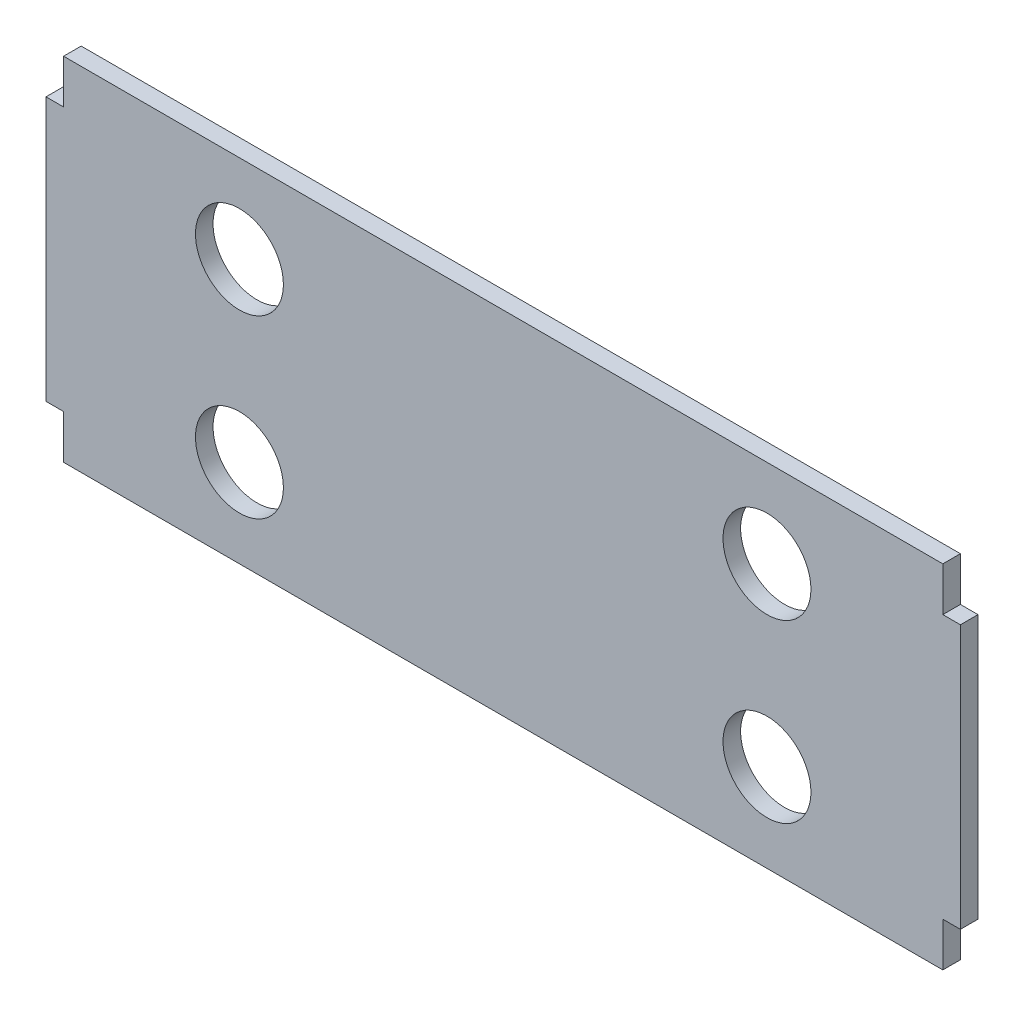
ISO-10303-21;
HEADER;
FILE_DESCRIPTION(('STEP AP214'),'2;1');
FILE_NAME('part.step','',(''),(''),'','','');
FILE_SCHEMA(('AUTOMOTIVE_DESIGN { 1 0 10303 214 1 1 1 1 }'));
ENDSEC;
DATA;
#1=APPLICATION_CONTEXT('core data for automotive mechanical design processes');
#2=APPLICATION_PROTOCOL_DEFINITION('international standard','automotive_design',2000,#1);
#3=PRODUCT_CONTEXT('',#1,'mechanical');
#4=PRODUCT('Part','Part','',(#3));
#5=PRODUCT_RELATED_PRODUCT_CATEGORY('part','',(#4));
#6=PRODUCT_DEFINITION_FORMATION('','',#4);
#7=PRODUCT_DEFINITION_CONTEXT('part definition',#1,'design');
#8=PRODUCT_DEFINITION('design','',#6,#7);
#9=PRODUCT_DEFINITION_SHAPE('','',#8);
#10=(LENGTH_UNIT() NAMED_UNIT(*) SI_UNIT(.MILLI.,.METRE.));
#11=(NAMED_UNIT(*) PLANE_ANGLE_UNIT() SI_UNIT($,.RADIAN.));
#12=(NAMED_UNIT(*) SI_UNIT($,.STERADIAN.) SOLID_ANGLE_UNIT());
#13=UNCERTAINTY_MEASURE_WITH_UNIT(LENGTH_MEASURE(1.E-05),#10,'distance_accuracy_value','');
#14=(GEOMETRIC_REPRESENTATION_CONTEXT(3) GLOBAL_UNCERTAINTY_ASSIGNED_CONTEXT((#13)) GLOBAL_UNIT_ASSIGNED_CONTEXT((#10,
#11,#12)) REPRESENTATION_CONTEXT('',''));
#15=CARTESIAN_POINT('',(0.,0.,0.));
#16=DIRECTION('',(0.,0.,1.));
#17=DIRECTION('',(1.,0.,0.));
#18=AXIS2_PLACEMENT_3D('',#15,#16,#17);
#19=CARTESIAN_POINT('',(0.,5.,2.));
#20=DIRECTION('',(0.,-1.,0.));
#21=DIRECTION('',(0.,0.,-1.));
#22=AXIS2_PLACEMENT_3D('',#19,#20,#21);
#23=PLANE('',#22);
#24=DIRECTION('',(-1.,0.,0.));
#25=VECTOR('',#24,1.);
#26=CARTESIAN_POINT('',(0.,5.,0.));
#27=LINE('',#26,#25);
#28=CARTESIAN_POINT('',(0.,5.,0.));
#29=VERTEX_POINT('',#28);
#30=CARTESIAN_POINT('',(-1.99999999999999,5.,0.));
#31=VERTEX_POINT('',#30);
#32=EDGE_CURVE('E211',#29,#31,#27,.T.);
#33=ORIENTED_EDGE('',*,*,#32,.F.);
#34=DIRECTION('',(0.,0.,-1.));
#35=VECTOR('',#34,1.);
#36=CARTESIAN_POINT('',(0.,5.,2.));
#37=LINE('',#36,#35);
#38=CARTESIAN_POINT('',(0.,5.,2.));
#39=VERTEX_POINT('',#38);
#40=EDGE_CURVE('E12',#39,#29,#37,.T.);
#41=ORIENTED_EDGE('',*,*,#40,.F.);
#42=DIRECTION('',(-1.,0.,0.));
#43=VECTOR('',#42,1.);
#44=CARTESIAN_POINT('',(0.,5.,2.));
#45=LINE('',#44,#43);
#46=CARTESIAN_POINT('',(-1.99999999999999,5.,2.));
#47=VERTEX_POINT('',#46);
#48=EDGE_CURVE('E192',#39,#47,#45,.T.);
#49=ORIENTED_EDGE('',*,*,#48,.T.);
#50=DIRECTION('',(0.,0.,-1.));
#51=VECTOR('',#50,1.);
#52=CARTESIAN_POINT('',(-1.99999999999999,5.,2.));
#53=LINE('',#52,#51);
#54=EDGE_CURVE('E130',#47,#31,#53,.T.);
#55=ORIENTED_EDGE('',*,*,#54,.T.);
#56=EDGE_LOOP('',(#33,#41,#49,#55));
#57=FACE_BOUND('',#56,.T.);
#58=ADVANCED_FACE('F67',(#57),#23,.T.);
#59=CARTESIAN_POINT('',(0.,0.,2.));
#60=DIRECTION('',(-1.,0.,0.));
#61=DIRECTION('',(0.,0.,1.));
#62=AXIS2_PLACEMENT_3D('',#59,#60,#61);
#63=PLANE('',#62);
#64=DIRECTION('',(0.,1.,0.));
#65=VECTOR('',#64,1.);
#66=CARTESIAN_POINT('',(0.,0.,0.));
#67=LINE('',#66,#65);
#68=CARTESIAN_POINT('',(0.,0.,0.));
#69=VERTEX_POINT('',#68);
#70=EDGE_CURVE('E266',#69,#29,#67,.T.);
#71=ORIENTED_EDGE('',*,*,#70,.F.);
#72=DIRECTION('',(0.,0.,-1.));
#73=VECTOR('',#72,1.);
#74=CARTESIAN_POINT('',(0.,0.,2.));
#75=LINE('',#74,#73);
#76=CARTESIAN_POINT('',(0.,0.,2.));
#77=VERTEX_POINT('',#76);
#78=EDGE_CURVE('E76',#77,#69,#75,.T.);
#79=ORIENTED_EDGE('',*,*,#78,.F.);
#80=DIRECTION('',(0.,1.,0.));
#81=VECTOR('',#80,1.);
#82=CARTESIAN_POINT('',(0.,0.,2.));
#83=LINE('',#82,#81);
#84=EDGE_CURVE('E183',#77,#39,#83,.T.);
#85=ORIENTED_EDGE('',*,*,#84,.T.);
#86=ORIENTED_EDGE('',*,*,#40,.T.);
#87=EDGE_LOOP('',(#71,#79,#85,#86));
#88=FACE_BOUND('',#87,.T.);
#89=ADVANCED_FACE('F255',(#88),#63,.T.);
#90=CARTESIAN_POINT('',(0.,0.,2.));
#91=DIRECTION('',(0.,1.,0.));
#92=DIRECTION('',(-1.,0.,0.));
#93=AXIS2_PLACEMENT_3D('',#90,#91,#92);
#94=PLANE('',#93);
#95=DIRECTION('',(1.,0.,0.));
#96=VECTOR('',#95,1.);
#97=CARTESIAN_POINT('',(0.,0.,0.));
#98=LINE('',#97,#96);
#99=CARTESIAN_POINT('',(100.,0.,0.));
#100=VERTEX_POINT('',#99);
#101=EDGE_CURVE('E271',#69,#100,#98,.T.);
#102=ORIENTED_EDGE('',*,*,#101,.T.);
#103=DIRECTION('',(0.,0.,-1.));
#104=VECTOR('',#103,1.);
#105=CARTESIAN_POINT('',(100.,0.,2.));
#106=LINE('',#105,#104);
#107=CARTESIAN_POINT('',(100.,0.,2.));
#108=VERTEX_POINT('',#107);
#109=EDGE_CURVE('E316',#108,#100,#106,.T.);
#110=ORIENTED_EDGE('',*,*,#109,.F.);
#111=DIRECTION('',(1.,0.,0.));
#112=VECTOR('',#111,1.);
#113=CARTESIAN_POINT('',(0.,0.,2.));
#114=LINE('',#113,#112);
#115=EDGE_CURVE('E191',#77,#108,#114,.T.);
#116=ORIENTED_EDGE('',*,*,#115,.F.);
#117=ORIENTED_EDGE('',*,*,#78,.T.);
#118=EDGE_LOOP('',(#102,#110,#116,#117));
#119=FACE_BOUND('',#118,.T.);
#120=ADVANCED_FACE('F259',(#119),#94,.F.);
#121=CARTESIAN_POINT('',(100.,0.,2.));
#122=DIRECTION('',(-1.,0.,0.));
#123=DIRECTION('',(0.,0.,1.));
#124=AXIS2_PLACEMENT_3D('',#121,#122,#123);
#125=PLANE('',#124);
#126=DIRECTION('',(0.,1.,0.));
#127=VECTOR('',#126,1.);
#128=CARTESIAN_POINT('',(100.,0.,0.));
#129=LINE('',#128,#127);
#130=CARTESIAN_POINT('',(100.,5.,0.));
#131=VERTEX_POINT('',#130);
#132=EDGE_CURVE('E275',#100,#131,#129,.T.);
#133=ORIENTED_EDGE('',*,*,#132,.T.);
#134=DIRECTION('',(0.,0.,-1.));
#135=VECTOR('',#134,1.);
#136=CARTESIAN_POINT('',(100.,5.,2.));
#137=LINE('',#136,#135);
#138=CARTESIAN_POINT('',(100.,5.,2.));
#139=VERTEX_POINT('',#138);
#140=EDGE_CURVE('E312',#139,#131,#137,.T.);
#141=ORIENTED_EDGE('',*,*,#140,.F.);
#142=DIRECTION('',(0.,1.,0.));
#143=VECTOR('',#142,1.);
#144=CARTESIAN_POINT('',(100.,0.,2.));
#145=LINE('',#144,#143);
#146=EDGE_CURVE('E197',#108,#139,#145,.T.);
#147=ORIENTED_EDGE('',*,*,#146,.F.);
#148=ORIENTED_EDGE('',*,*,#109,.T.);
#149=EDGE_LOOP('',(#133,#141,#147,#148));
#150=FACE_BOUND('',#149,.T.);
#151=ADVANCED_FACE('F332',(#150),#125,.F.);
#152=CARTESIAN_POINT('',(0.,5.,2.));
#153=DIRECTION('',(0.,1.,0.));
#154=DIRECTION('',(0.,0.,1.));
#155=AXIS2_PLACEMENT_3D('',#152,#153,#154);
#156=PLANE('',#155);
#157=DIRECTION('',(1.,0.,0.));
#158=VECTOR('',#157,1.);
#159=CARTESIAN_POINT('',(0.,5.,0.));
#160=LINE('',#159,#158);
#161=CARTESIAN_POINT('',(102.,5.,0.));
#162=VERTEX_POINT('',#161);
#163=EDGE_CURVE('E584',#131,#162,#160,.T.);
#164=ORIENTED_EDGE('',*,*,#163,.T.);
#165=DIRECTION('',(0.,0.,-1.));
#166=VECTOR('',#165,1.);
#167=CARTESIAN_POINT('',(102.,5.,2.));
#168=LINE('',#167,#166);
#169=CARTESIAN_POINT('',(102.,5.,2.));
#170=VERTEX_POINT('',#169);
#171=EDGE_CURVE('E309',#170,#162,#168,.T.);
#172=ORIENTED_EDGE('',*,*,#171,.F.);
#173=DIRECTION('',(1.,0.,0.));
#174=VECTOR('',#173,1.);
#175=CARTESIAN_POINT('',(0.,5.,2.));
#176=LINE('',#175,#174);
#177=EDGE_CURVE('E327',#139,#170,#176,.T.);
#178=ORIENTED_EDGE('',*,*,#177,.F.);
#179=ORIENTED_EDGE('',*,*,#140,.T.);
#180=EDGE_LOOP('',(#164,#172,#178,#179));
#181=FACE_BOUND('',#180,.T.);
#182=ADVANCED_FACE('F336',(#181),#156,.F.);
#183=CARTESIAN_POINT('',(102.,0.,2.));
#184=DIRECTION('',(1.,0.,0.));
#185=DIRECTION('',(0.,0.,-1.));
#186=AXIS2_PLACEMENT_3D('',#183,#184,#185);
#187=PLANE('',#186);
#188=DIRECTION('',(0.,-1.,0.));
#189=VECTOR('',#188,1.);
#190=CARTESIAN_POINT('',(102.,0.,0.));
#191=LINE('',#190,#189);
#192=CARTESIAN_POINT('',(102.,35.,0.));
#193=VERTEX_POINT('',#192);
#194=EDGE_CURVE('E581',#193,#162,#191,.T.);
#195=ORIENTED_EDGE('',*,*,#194,.F.);
#196=DIRECTION('',(0.,0.,-1.));
#197=VECTOR('',#196,1.);
#198=CARTESIAN_POINT('',(102.,35.,2.));
#199=LINE('',#198,#197);
#200=CARTESIAN_POINT('',(102.,35.,2.));
#201=VERTEX_POINT('',#200);
#202=EDGE_CURVE('E306',#201,#193,#199,.T.);
#203=ORIENTED_EDGE('',*,*,#202,.F.);
#204=DIRECTION('',(0.,-1.,0.));
#205=VECTOR('',#204,1.);
#206=CARTESIAN_POINT('',(102.,0.,2.));
#207=LINE('',#206,#205);
#208=EDGE_CURVE('E339',#201,#170,#207,.T.);
#209=ORIENTED_EDGE('',*,*,#208,.T.);
#210=ORIENTED_EDGE('',*,*,#171,.T.);
#211=EDGE_LOOP('',(#195,#203,#209,#210));
#212=FACE_BOUND('',#211,.T.);
#213=ADVANCED_FACE('F370',(#212),#187,.T.);
#214=CARTESIAN_POINT('',(0.,35.,2.));
#215=DIRECTION('',(0.,1.,0.));
#216=DIRECTION('',(0.,0.,1.));
#217=AXIS2_PLACEMENT_3D('',#214,#215,#216);
#218=PLANE('',#217);
#219=DIRECTION('',(1.,0.,0.));
#220=VECTOR('',#219,1.);
#221=CARTESIAN_POINT('',(0.,35.,0.));
#222=LINE('',#221,#220);
#223=CARTESIAN_POINT('',(100.,35.,0.));
#224=VERTEX_POINT('',#223);
#225=EDGE_CURVE('E289',#224,#193,#222,.T.);
#226=ORIENTED_EDGE('',*,*,#225,.F.);
#227=DIRECTION('',(0.,0.,-1.));
#228=VECTOR('',#227,1.);
#229=CARTESIAN_POINT('',(100.,35.,2.));
#230=LINE('',#229,#228);
#231=CARTESIAN_POINT('',(100.,35.,2.));
#232=VERTEX_POINT('',#231);
#233=EDGE_CURVE('E303',#232,#224,#230,.T.);
#234=ORIENTED_EDGE('',*,*,#233,.F.);
#235=DIRECTION('',(1.,0.,0.));
#236=VECTOR('',#235,1.);
#237=CARTESIAN_POINT('',(0.,35.,2.));
#238=LINE('',#237,#236);
#239=EDGE_CURVE('E342',#232,#201,#238,.T.);
#240=ORIENTED_EDGE('',*,*,#239,.T.);
#241=ORIENTED_EDGE('',*,*,#202,.T.);
#242=EDGE_LOOP('',(#226,#234,#240,#241));
#243=FACE_BOUND('',#242,.T.);
#244=ADVANCED_FACE('F364',(#243),#218,.T.);
#245=CARTESIAN_POINT('',(100.,40.,0.));
#246=VERTEX_POINT('',#245);
#247=EDGE_CURVE('E283',#224,#246,#129,.T.);
#248=ORIENTED_EDGE('',*,*,#247,.T.);
#249=DIRECTION('',(0.,0.,-1.));
#250=VECTOR('',#249,1.);
#251=CARTESIAN_POINT('',(100.,40.,2.));
#252=LINE('',#251,#250);
#253=CARTESIAN_POINT('',(100.,40.,2.));
#254=VERTEX_POINT('',#253);
#255=EDGE_CURVE('E300',#254,#246,#252,.T.);
#256=ORIENTED_EDGE('',*,*,#255,.F.);
#257=EDGE_CURVE('E185',#232,#254,#145,.T.);
#258=ORIENTED_EDGE('',*,*,#257,.F.);
#259=ORIENTED_EDGE('',*,*,#233,.T.);
#260=EDGE_LOOP('',(#248,#256,#258,#259));
#261=FACE_BOUND('',#260,.T.);
#262=ADVANCED_FACE('F355',(#261),#125,.F.);
#263=CARTESIAN_POINT('',(0.,40.,2.));
#264=DIRECTION('',(0.,1.,0.));
#265=DIRECTION('',(-1.,0.,0.));
#266=AXIS2_PLACEMENT_3D('',#263,#264,#265);
#267=PLANE('',#266);
#268=DIRECTION('',(1.,0.,0.));
#269=VECTOR('',#268,1.);
#270=CARTESIAN_POINT('',(0.,40.,0.));
#271=LINE('',#270,#269);
#272=CARTESIAN_POINT('',(0.,40.,0.));
#273=VERTEX_POINT('',#272);
#274=EDGE_CURVE('E278',#273,#246,#271,.T.);
#275=ORIENTED_EDGE('',*,*,#274,.F.);
#276=DIRECTION('',(0.,0.,-1.));
#277=VECTOR('',#276,1.);
#278=CARTESIAN_POINT('',(0.,40.,2.));
#279=LINE('',#278,#277);
#280=CARTESIAN_POINT('',(0.,40.,2.));
#281=VERTEX_POINT('',#280);
#282=EDGE_CURVE('E170',#281,#273,#279,.T.);
#283=ORIENTED_EDGE('',*,*,#282,.F.);
#284=DIRECTION('',(1.,0.,0.));
#285=VECTOR('',#284,1.);
#286=CARTESIAN_POINT('',(0.,40.,2.));
#287=LINE('',#286,#285);
#288=EDGE_CURVE('E180',#281,#254,#287,.T.);
#289=ORIENTED_EDGE('',*,*,#288,.T.);
#290=ORIENTED_EDGE('',*,*,#255,.T.);
#291=EDGE_LOOP('',(#275,#283,#289,#290));
#292=FACE_BOUND('',#291,.T.);
#293=ADVANCED_FACE('F357',(#292),#267,.T.);
#294=CARTESIAN_POINT('',(0.,35.,0.));
#295=VERTEX_POINT('',#294);
#296=EDGE_CURVE('E168',#295,#273,#67,.T.);
#297=ORIENTED_EDGE('',*,*,#296,.F.);
#298=DIRECTION('',(0.,0.,-1.));
#299=VECTOR('',#298,1.);
#300=CARTESIAN_POINT('',(0.,35.,2.));
#301=LINE('',#300,#299);
#302=CARTESIAN_POINT('',(0.,35.,2.));
#303=VERTEX_POINT('',#302);
#304=EDGE_CURVE('E162',#303,#295,#301,.T.);
#305=ORIENTED_EDGE('',*,*,#304,.F.);
#306=EDGE_CURVE('E166',#303,#281,#83,.T.);
#307=ORIENTED_EDGE('',*,*,#306,.T.);
#308=ORIENTED_EDGE('',*,*,#282,.T.);
#309=EDGE_LOOP('',(#297,#305,#307,#308));
#310=FACE_BOUND('',#309,.T.);
#311=ADVANCED_FACE('F164',(#310),#63,.T.);
#312=CARTESIAN_POINT('',(0.,35.,2.));
#313=DIRECTION('',(0.,-1.,0.));
#314=DIRECTION('',(0.,0.,-1.));
#315=AXIS2_PLACEMENT_3D('',#312,#313,#314);
#316=PLANE('',#315);
#317=DIRECTION('',(-1.,0.,0.));
#318=VECTOR('',#317,1.);
#319=CARTESIAN_POINT('',(0.,35.,0.));
#320=LINE('',#319,#318);
#321=CARTESIAN_POINT('',(-2.,35.,0.));
#322=VERTEX_POINT('',#321);
#323=EDGE_CURVE('E123',#295,#322,#320,.T.);
#324=ORIENTED_EDGE('',*,*,#323,.T.);
#325=DIRECTION('',(0.,0.,-1.));
#326=VECTOR('',#325,1.);
#327=CARTESIAN_POINT('',(-2.,35.,2.));
#328=LINE('',#327,#326);
#329=CARTESIAN_POINT('',(-2.,35.,2.));
#330=VERTEX_POINT('',#329);
#331=EDGE_CURVE('E171',#330,#322,#328,.T.);
#332=ORIENTED_EDGE('',*,*,#331,.F.);
#333=DIRECTION('',(-1.,0.,0.));
#334=VECTOR('',#333,1.);
#335=CARTESIAN_POINT('',(0.,35.,2.));
#336=LINE('',#335,#334);
#337=EDGE_CURVE('E173',#303,#330,#336,.T.);
#338=ORIENTED_EDGE('',*,*,#337,.F.);
#339=ORIENTED_EDGE('',*,*,#304,.T.);
#340=EDGE_LOOP('',(#324,#332,#338,#339));
#341=FACE_BOUND('',#340,.T.);
#342=ADVANCED_FACE('F174',(#341),#316,.F.);
#343=CARTESIAN_POINT('',(-1.99999999999999,0.,2.));
#344=DIRECTION('',(1.,0.,0.));
#345=DIRECTION('',(0.,1.,0.));
#346=AXIS2_PLACEMENT_3D('',#343,#344,#345);
#347=PLANE('',#346);
#348=DIRECTION('',(0.,-1.,0.));
#349=VECTOR('',#348,1.);
#350=CARTESIAN_POINT('',(-1.99999999999999,0.,0.));
#351=LINE('',#350,#349);
#352=EDGE_CURVE('E198',#322,#31,#351,.T.);
#353=ORIENTED_EDGE('',*,*,#352,.T.);
#354=ORIENTED_EDGE('',*,*,#54,.F.);
#355=DIRECTION('',(0.,-1.,0.));
#356=VECTOR('',#355,1.);
#357=CARTESIAN_POINT('',(-1.99999999999999,0.,2.));
#358=LINE('',#357,#356);
#359=EDGE_CURVE('E84',#330,#47,#358,.T.);
#360=ORIENTED_EDGE('',*,*,#359,.F.);
#361=ORIENTED_EDGE('',*,*,#331,.T.);
#362=EDGE_LOOP('',(#353,#354,#360,#361));
#363=FACE_BOUND('',#362,.T.);
#364=ADVANCED_FACE('F419',(#363),#347,.F.);
#365=CARTESIAN_POINT('',(0.,0.,2.));
#366=DIRECTION('',(0.,0.,1.));
#367=DIRECTION('',(1.,0.,0.));
#368=AXIS2_PLACEMENT_3D('',#365,#366,#367);
#369=PLANE('',#368);
#370=CARTESIAN_POINT('',(20.,10.,2.));
#371=DIRECTION('',(0.,0.,1.));
#372=DIRECTION('',(1.,0.,0.));
#373=AXIS2_PLACEMENT_3D('',#370,#371,#372);
#374=CIRCLE('',#373,5.);
#375=CARTESIAN_POINT('',(25.,10.,2.));
#376=VERTEX_POINT('',#375);
#377=EDGE_CURVE('E212',#376,#376,#374,.T.);
#378=ORIENTED_EDGE('',*,*,#377,.F.);
#379=EDGE_LOOP('',(#378));
#380=FACE_BOUND('',#379,.T.);
#381=CARTESIAN_POINT('',(80.,10.,2.));
#382=DIRECTION('',(0.,0.,1.));
#383=DIRECTION('',(1.,0.,0.));
#384=AXIS2_PLACEMENT_3D('',#381,#382,#383);
#385=CIRCLE('',#384,5.);
#386=CARTESIAN_POINT('',(85.,10.,2.));
#387=VERTEX_POINT('',#386);
#388=EDGE_CURVE('E220',#387,#387,#385,.T.);
#389=ORIENTED_EDGE('',*,*,#388,.F.);
#390=EDGE_LOOP('',(#389));
#391=FACE_BOUND('',#390,.T.);
#392=CARTESIAN_POINT('',(80.,30.,2.));
#393=DIRECTION('',(0.,0.,1.));
#394=DIRECTION('',(1.,0.,0.));
#395=AXIS2_PLACEMENT_3D('',#392,#393,#394);
#396=CIRCLE('',#395,4.99999999999999);
#397=CARTESIAN_POINT('',(85.,30.,2.));
#398=VERTEX_POINT('',#397);
#399=EDGE_CURVE('E228',#398,#398,#396,.T.);
#400=ORIENTED_EDGE('',*,*,#399,.F.);
#401=EDGE_LOOP('',(#400));
#402=FACE_BOUND('',#401,.T.);
#403=CARTESIAN_POINT('',(20.,30.,2.));
#404=DIRECTION('',(0.,0.,1.));
#405=DIRECTION('',(1.,0.,0.));
#406=AXIS2_PLACEMENT_3D('',#403,#404,#405);
#407=CIRCLE('',#406,5.);
#408=CARTESIAN_POINT('',(25.,30.,2.));
#409=VERTEX_POINT('',#408);
#410=EDGE_CURVE('E206',#409,#409,#407,.T.);
#411=ORIENTED_EDGE('',*,*,#410,.F.);
#412=EDGE_LOOP('',(#411));
#413=FACE_BOUND('',#412,.T.);
#414=ORIENTED_EDGE('',*,*,#48,.F.);
#415=ORIENTED_EDGE('',*,*,#84,.F.);
#416=ORIENTED_EDGE('',*,*,#115,.T.);
#417=ORIENTED_EDGE('',*,*,#146,.T.);
#418=ORIENTED_EDGE('',*,*,#177,.T.);
#419=ORIENTED_EDGE('',*,*,#208,.F.);
#420=ORIENTED_EDGE('',*,*,#239,.F.);
#421=ORIENTED_EDGE('',*,*,#257,.T.);
#422=ORIENTED_EDGE('',*,*,#288,.F.);
#423=ORIENTED_EDGE('',*,*,#306,.F.);
#424=ORIENTED_EDGE('',*,*,#337,.T.);
#425=ORIENTED_EDGE('',*,*,#359,.T.);
#426=EDGE_LOOP('',(#414,#415,#416,#417,#418,#419,#420,#421,#422,#423,#424,#425));
#427=FACE_BOUND('',#426,.T.);
#428=ADVANCED_FACE('F178',(#380,#391,#402,#413,#427),#369,.T.);
#429=CARTESIAN_POINT('',(0.,0.,0.));
#430=DIRECTION('',(0.,0.,1.));
#431=DIRECTION('',(1.,0.,0.));
#432=AXIS2_PLACEMENT_3D('',#429,#430,#431);
#433=PLANE('',#432);
#434=CARTESIAN_POINT('',(20.,10.,0.));
#435=DIRECTION('',(0.,0.,1.));
#436=DIRECTION('',(1.,0.,0.));
#437=AXIS2_PLACEMENT_3D('',#434,#435,#436);
#438=CIRCLE('',#437,5.);
#439=CARTESIAN_POINT('',(25.,10.,0.));
#440=VERTEX_POINT('',#439);
#441=EDGE_CURVE('E216',#440,#440,#438,.T.);
#442=ORIENTED_EDGE('',*,*,#441,.T.);
#443=EDGE_LOOP('',(#442));
#444=FACE_BOUND('',#443,.T.);
#445=CARTESIAN_POINT('',(80.,10.,0.));
#446=DIRECTION('',(0.,0.,1.));
#447=DIRECTION('',(1.,0.,0.));
#448=AXIS2_PLACEMENT_3D('',#445,#446,#447);
#449=CIRCLE('',#448,5.);
#450=CARTESIAN_POINT('',(85.,10.,0.));
#451=VERTEX_POINT('',#450);
#452=EDGE_CURVE('E224',#451,#451,#449,.T.);
#453=ORIENTED_EDGE('',*,*,#452,.T.);
#454=EDGE_LOOP('',(#453));
#455=FACE_BOUND('',#454,.T.);
#456=CARTESIAN_POINT('',(80.,30.,0.));
#457=DIRECTION('',(0.,0.,1.));
#458=DIRECTION('',(1.,0.,0.));
#459=AXIS2_PLACEMENT_3D('',#456,#457,#458);
#460=CIRCLE('',#459,4.99999999999999);
#461=CARTESIAN_POINT('',(85.,30.,0.));
#462=VERTEX_POINT('',#461);
#463=EDGE_CURVE('E207',#462,#462,#460,.T.);
#464=ORIENTED_EDGE('',*,*,#463,.T.);
#465=EDGE_LOOP('',(#464));
#466=FACE_BOUND('',#465,.T.);
#467=CARTESIAN_POINT('',(20.,30.,0.));
#468=DIRECTION('',(0.,0.,1.));
#469=DIRECTION('',(1.,0.,0.));
#470=AXIS2_PLACEMENT_3D('',#467,#468,#469);
#471=CIRCLE('',#470,5.);
#472=CARTESIAN_POINT('',(25.,30.,0.));
#473=VERTEX_POINT('',#472);
#474=EDGE_CURVE('E202',#473,#473,#471,.T.);
#475=ORIENTED_EDGE('',*,*,#474,.T.);
#476=EDGE_LOOP('',(#475));
#477=FACE_BOUND('',#476,.T.);
#478=ORIENTED_EDGE('',*,*,#32,.T.);
#479=ORIENTED_EDGE('',*,*,#352,.F.);
#480=ORIENTED_EDGE('',*,*,#323,.F.);
#481=ORIENTED_EDGE('',*,*,#296,.T.);
#482=ORIENTED_EDGE('',*,*,#274,.T.);
#483=ORIENTED_EDGE('',*,*,#247,.F.);
#484=ORIENTED_EDGE('',*,*,#225,.T.);
#485=ORIENTED_EDGE('',*,*,#194,.T.);
#486=ORIENTED_EDGE('',*,*,#163,.F.);
#487=ORIENTED_EDGE('',*,*,#132,.F.);
#488=ORIENTED_EDGE('',*,*,#101,.F.);
#489=ORIENTED_EDGE('',*,*,#70,.T.);
#490=EDGE_LOOP('',(#478,#479,#480,#481,#482,#483,#484,#485,#486,#487,#488,#489));
#491=FACE_BOUND('',#490,.T.);
#492=ADVANCED_FACE('F236',(#444,#455,#466,#477,#491),#433,.F.);
#493=CARTESIAN_POINT('',(20.,30.,2.));
#494=DIRECTION('',(0.,0.,-1.));
#495=DIRECTION('',(-1.,0.,0.));
#496=AXIS2_PLACEMENT_3D('',#493,#494,#495);
#497=CYLINDRICAL_SURFACE('',#496,5.);
#498=ORIENTED_EDGE('',*,*,#410,.T.);
#499=EDGE_LOOP('',(#498));
#500=FACE_BOUND('',#499,.T.);
#501=ORIENTED_EDGE('',*,*,#474,.F.);
#502=EDGE_LOOP('',(#501));
#503=FACE_BOUND('',#502,.T.);
#504=ADVANCED_FACE('F242',(#500,#503),#497,.F.);
#505=CARTESIAN_POINT('',(80.,30.,2.));
#506=DIRECTION('',(0.,0.,-1.));
#507=DIRECTION('',(-1.,0.,0.));
#508=AXIS2_PLACEMENT_3D('',#505,#506,#507);
#509=CYLINDRICAL_SURFACE('',#508,4.99999999999999);
#510=ORIENTED_EDGE('',*,*,#399,.T.);
#511=EDGE_LOOP('',(#510));
#512=FACE_BOUND('',#511,.T.);
#513=ORIENTED_EDGE('',*,*,#463,.F.);
#514=EDGE_LOOP('',(#513));
#515=FACE_BOUND('',#514,.T.);
#516=ADVANCED_FACE('F239',(#512,#515),#509,.F.);
#517=CARTESIAN_POINT('',(80.,10.,2.));
#518=DIRECTION('',(0.,0.,-1.));
#519=DIRECTION('',(-1.,0.,0.));
#520=AXIS2_PLACEMENT_3D('',#517,#518,#519);
#521=CYLINDRICAL_SURFACE('',#520,5.);
#522=ORIENTED_EDGE('',*,*,#388,.T.);
#523=EDGE_LOOP('',(#522));
#524=FACE_BOUND('',#523,.T.);
#525=ORIENTED_EDGE('',*,*,#452,.F.);
#526=EDGE_LOOP('',(#525));
#527=FACE_BOUND('',#526,.T.);
#528=ADVANCED_FACE('F241',(#524,#527),#521,.F.);
#529=CARTESIAN_POINT('',(20.,10.,2.));
#530=DIRECTION('',(0.,0.,-1.));
#531=DIRECTION('',(-1.,0.,0.));
#532=AXIS2_PLACEMENT_3D('',#529,#530,#531);
#533=CYLINDRICAL_SURFACE('',#532,5.);
#534=ORIENTED_EDGE('',*,*,#377,.T.);
#535=EDGE_LOOP('',(#534));
#536=FACE_BOUND('',#535,.T.);
#537=ORIENTED_EDGE('',*,*,#441,.F.);
#538=EDGE_LOOP('',(#537));
#539=FACE_BOUND('',#538,.T.);
#540=ADVANCED_FACE('F249',(#536,#539),#533,.F.);
#541=CLOSED_SHELL('',(#58,#89,#120,#151,#182,#213,#244,#262,#293,#311,#342,#364,#428,#492,#504,
#516,#528,#540));
#542=MANIFOLD_SOLID_BREP('B2',#541);
#543=ADVANCED_BREP_SHAPE_REPRESENTATION('',(#18,#542),#14);
#544=SHAPE_DEFINITION_REPRESENTATION(#9,#543);
ENDSEC;
END-ISO-10303-21;
